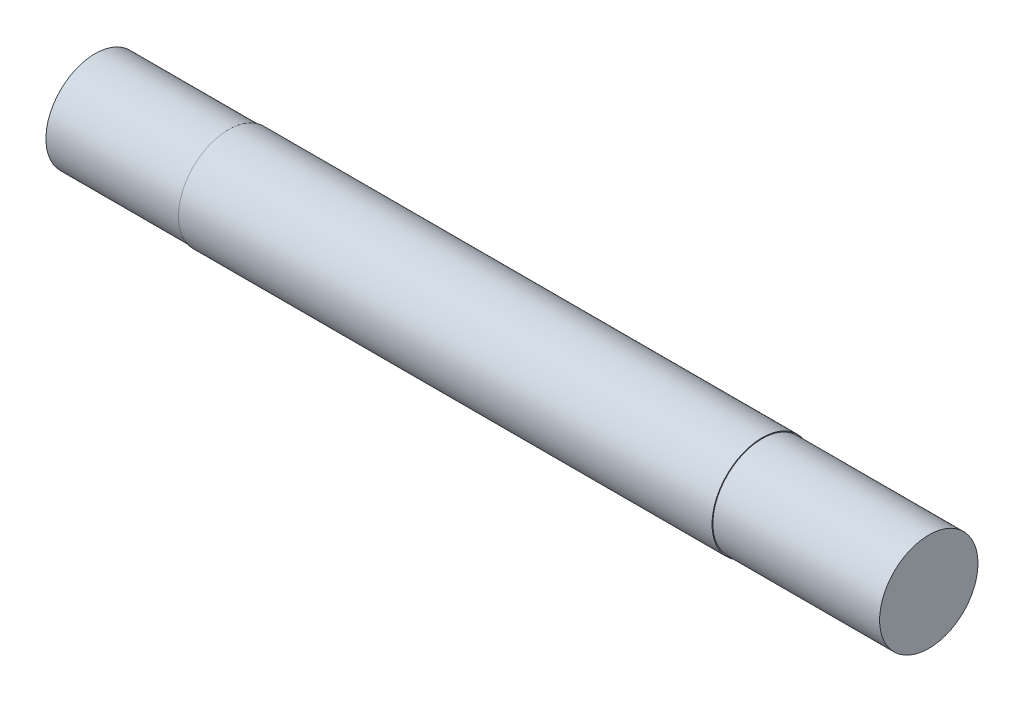
ISO-10303-21;
HEADER;
FILE_DESCRIPTION(('STEP AP214'),'2;1');
FILE_NAME('part.step','',(''),(''),'','','');
FILE_SCHEMA(('AUTOMOTIVE_DESIGN { 1 0 10303 214 1 1 1 1 }'));
ENDSEC;
DATA;
#1=APPLICATION_CONTEXT('core data for automotive mechanical design processes');
#2=APPLICATION_PROTOCOL_DEFINITION('international standard','automotive_design',2000,#1);
#3=PRODUCT_CONTEXT('',#1,'mechanical');
#4=PRODUCT('Part','Part','',(#3));
#5=PRODUCT_RELATED_PRODUCT_CATEGORY('part','',(#4));
#6=PRODUCT_DEFINITION_FORMATION('','',#4);
#7=PRODUCT_DEFINITION_CONTEXT('part definition',#1,'design');
#8=PRODUCT_DEFINITION('design','',#6,#7);
#9=PRODUCT_DEFINITION_SHAPE('','',#8);
#10=(LENGTH_UNIT() NAMED_UNIT(*) SI_UNIT(.MILLI.,.METRE.));
#11=(NAMED_UNIT(*) PLANE_ANGLE_UNIT() SI_UNIT($,.RADIAN.));
#12=(NAMED_UNIT(*) SI_UNIT($,.STERADIAN.) SOLID_ANGLE_UNIT());
#13=UNCERTAINTY_MEASURE_WITH_UNIT(LENGTH_MEASURE(1.E-05),#10,'distance_accuracy_value','');
#14=(GEOMETRIC_REPRESENTATION_CONTEXT(3) GLOBAL_UNCERTAINTY_ASSIGNED_CONTEXT((#13)) GLOBAL_UNIT_ASSIGNED_CONTEXT((#10,
#11,#12)) REPRESENTATION_CONTEXT('',''));
#15=CARTESIAN_POINT('',(0.,0.,0.));
#16=DIRECTION('',(0.,0.,1.));
#17=DIRECTION('',(1.,0.,0.));
#18=AXIS2_PLACEMENT_3D('',#15,#16,#17);
#19=CARTESIAN_POINT('',(0.,0.,0.));
#20=DIRECTION('',(-1.,0.,0.));
#21=DIRECTION('',(0.,0.,1.));
#22=AXIS2_PLACEMENT_3D('',#19,#20,#21);
#23=PLANE('',#22);
#24=CARTESIAN_POINT('',(0.,0.,0.));
#25=DIRECTION('',(1.,0.,0.));
#26=DIRECTION('',(0.,0.,-1.));
#27=AXIS2_PLACEMENT_3D('',#24,#25,#26);
#28=CIRCLE('',#27,2.95);
#29=CARTESIAN_POINT('',(0.,0.,-2.95));
#30=VERTEX_POINT('',#29);
#31=EDGE_CURVE('E10',#30,#30,#28,.T.);
#32=ORIENTED_EDGE('',*,*,#31,.F.);
#33=EDGE_LOOP('',(#32));
#34=FACE_BOUND('',#33,.T.);
#35=ADVANCED_FACE('F34',(#34),#23,.T.);
#36=CARTESIAN_POINT('',(0.,0.,0.));
#37=DIRECTION('',(1.,0.,0.));
#38=DIRECTION('',(0.,0.,-1.));
#39=AXIS2_PLACEMENT_3D('',#36,#37,#38);
#40=CYLINDRICAL_SURFACE('',#39,2.95);
#41=ORIENTED_EDGE('',*,*,#31,.T.);
#42=EDGE_LOOP('',(#41));
#43=FACE_BOUND('',#42,.T.);
#44=CARTESIAN_POINT('',(8.,0.,0.));
#45=DIRECTION('',(1.,0.,0.));
#46=DIRECTION('',(0.,0.,-1.));
#47=AXIS2_PLACEMENT_3D('',#44,#45,#46);
#48=CIRCLE('',#47,2.95);
#49=CARTESIAN_POINT('',(8.,0.,-2.95));
#50=VERTEX_POINT('',#49);
#51=EDGE_CURVE('E40',#50,#50,#48,.T.);
#52=ORIENTED_EDGE('',*,*,#51,.F.);
#53=EDGE_LOOP('',(#52));
#54=FACE_BOUND('',#53,.T.);
#55=ADVANCED_FACE('F76',(#43,#54),#40,.T.);
#56=CARTESIAN_POINT('',(8.,0.,-2.95));
#57=DIRECTION('',(-1.,0.,0.));
#58=DIRECTION('',(0.,0.,1.));
#59=AXIS2_PLACEMENT_3D('',#56,#57,#58);
#60=PLANE('',#59);
#61=ORIENTED_EDGE('',*,*,#51,.T.);
#62=EDGE_LOOP('',(#61));
#63=FACE_BOUND('',#62,.T.);
#64=CARTESIAN_POINT('',(8.,0.,0.));
#65=DIRECTION('',(1.,0.,0.));
#66=DIRECTION('',(0.,0.,-1.));
#67=AXIS2_PLACEMENT_3D('',#64,#65,#66);
#68=CIRCLE('',#67,3.);
#69=CARTESIAN_POINT('',(8.,0.,-3.));
#70=VERTEX_POINT('',#69);
#71=EDGE_CURVE('E44',#70,#70,#68,.T.);
#72=ORIENTED_EDGE('',*,*,#71,.F.);
#73=EDGE_LOOP('',(#72));
#74=FACE_BOUND('',#73,.T.);
#75=ADVANCED_FACE('F81',(#63,#74),#60,.T.);
#76=CARTESIAN_POINT('',(0.,0.,0.));
#77=DIRECTION('',(1.,0.,0.));
#78=DIRECTION('',(0.,0.,-1.));
#79=AXIS2_PLACEMENT_3D('',#76,#77,#78);
#80=CYLINDRICAL_SURFACE('',#79,3.);
#81=ORIENTED_EDGE('',*,*,#71,.T.);
#82=EDGE_LOOP('',(#81));
#83=FACE_BOUND('',#82,.T.);
#84=CARTESIAN_POINT('',(40.,0.,0.));
#85=DIRECTION('',(1.,0.,0.));
#86=DIRECTION('',(0.,0.,-1.));
#87=AXIS2_PLACEMENT_3D('',#84,#85,#86);
#88=CIRCLE('',#87,3.);
#89=CARTESIAN_POINT('',(40.,0.,-3.));
#90=VERTEX_POINT('',#89);
#91=EDGE_CURVE('E48',#90,#90,#88,.T.);
#92=ORIENTED_EDGE('',*,*,#91,.F.);
#93=EDGE_LOOP('',(#92));
#94=FACE_BOUND('',#93,.T.);
#95=ADVANCED_FACE('F72',(#83,#94),#80,.T.);
#96=CARTESIAN_POINT('',(40.,0.,-2.95));
#97=DIRECTION('',(1.,0.,0.));
#98=DIRECTION('',(0.,0.,-1.));
#99=AXIS2_PLACEMENT_3D('',#96,#97,#98);
#100=PLANE('',#99);
#101=ORIENTED_EDGE('',*,*,#91,.T.);
#102=EDGE_LOOP('',(#101));
#103=FACE_BOUND('',#102,.T.);
#104=CARTESIAN_POINT('',(40.,0.,0.));
#105=DIRECTION('',(1.,0.,0.));
#106=DIRECTION('',(0.,0.,-1.));
#107=AXIS2_PLACEMENT_3D('',#104,#105,#106);
#108=CIRCLE('',#107,2.95);
#109=CARTESIAN_POINT('',(40.,0.,-2.95));
#110=VERTEX_POINT('',#109);
#111=EDGE_CURVE('E53',#110,#110,#108,.T.);
#112=ORIENTED_EDGE('',*,*,#111,.F.);
#113=EDGE_LOOP('',(#112));
#114=FACE_BOUND('',#113,.T.);
#115=ADVANCED_FACE('F64',(#103,#114),#100,.T.);
#116=CARTESIAN_POINT('',(0.,0.,0.));
#117=DIRECTION('',(1.,0.,0.));
#118=DIRECTION('',(0.,0.,-1.));
#119=AXIS2_PLACEMENT_3D('',#116,#117,#118);
#120=CYLINDRICAL_SURFACE('',#119,2.95);
#121=ORIENTED_EDGE('',*,*,#111,.T.);
#122=EDGE_LOOP('',(#121));
#123=FACE_BOUND('',#122,.T.);
#124=CARTESIAN_POINT('',(50.,0.,0.));
#125=DIRECTION('',(1.,0.,0.));
#126=DIRECTION('',(0.,0.,-1.));
#127=AXIS2_PLACEMENT_3D('',#124,#125,#126);
#128=CIRCLE('',#127,2.95);
#129=CARTESIAN_POINT('',(50.,0.,-2.95));
#130=VERTEX_POINT('',#129);
#131=EDGE_CURVE('E56',#130,#130,#128,.T.);
#132=ORIENTED_EDGE('',*,*,#131,.F.);
#133=EDGE_LOOP('',(#132));
#134=FACE_BOUND('',#133,.T.);
#135=ADVANCED_FACE('F62',(#123,#134),#120,.T.);
#136=CARTESIAN_POINT('',(50.,0.,0.));
#137=DIRECTION('',(1.,0.,0.));
#138=DIRECTION('',(0.,0.,-1.));
#139=AXIS2_PLACEMENT_3D('',#136,#137,#138);
#140=PLANE('',#139);
#141=ORIENTED_EDGE('',*,*,#131,.T.);
#142=EDGE_LOOP('',(#141));
#143=FACE_BOUND('',#142,.T.);
#144=ADVANCED_FACE('F60',(#143),#140,.T.);
#145=CLOSED_SHELL('',(#35,#55,#75,#95,#115,#135,#144));
#146=MANIFOLD_SOLID_BREP('B2',#145);
#147=ADVANCED_BREP_SHAPE_REPRESENTATION('',(#18,#146),#14);
#148=SHAPE_DEFINITION_REPRESENTATION(#9,#147);
ENDSEC;
END-ISO-10303-21;
